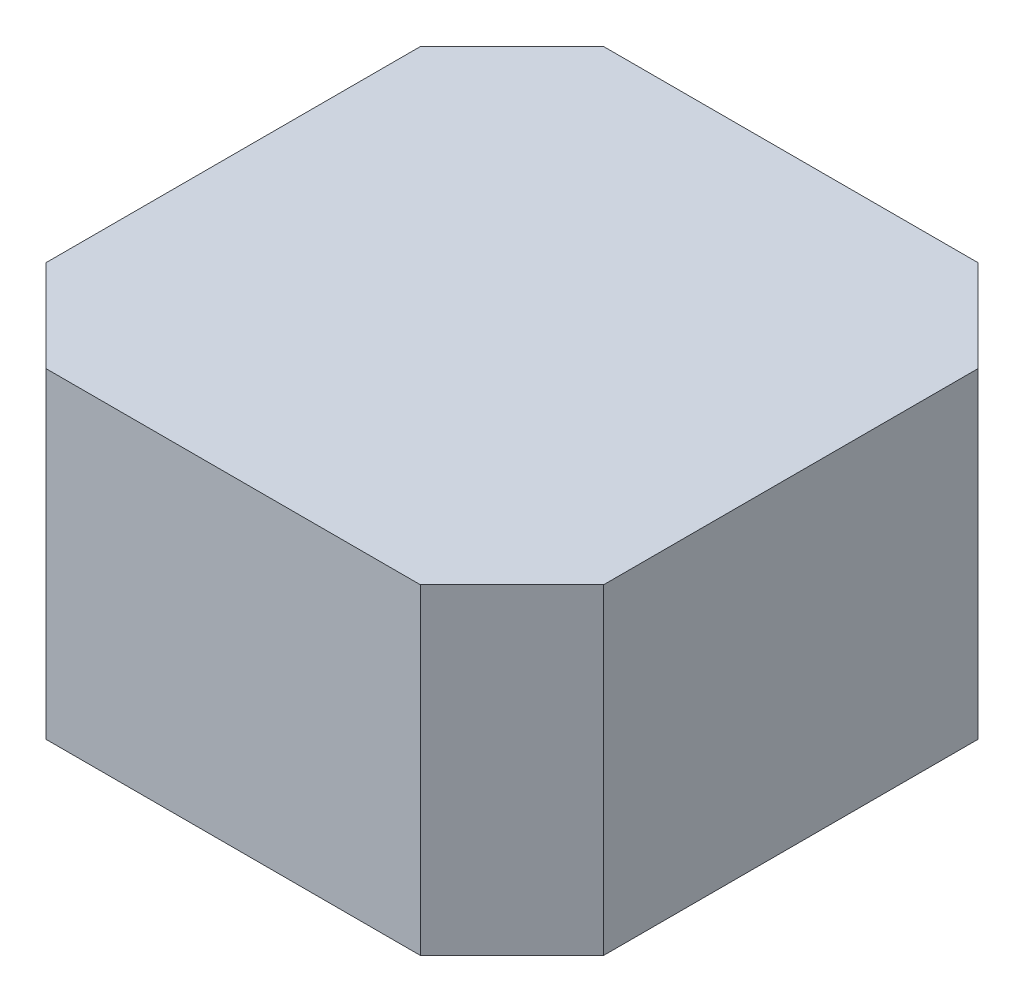
ISO-10303-21;
HEADER;
FILE_DESCRIPTION(('STEP AP214'),'2;1');
FILE_NAME('part.step','',(''),(''),'','','');
FILE_SCHEMA(('AUTOMOTIVE_DESIGN { 1 0 10303 214 1 1 1 1 }'));
ENDSEC;
DATA;
#1=APPLICATION_CONTEXT('core data for automotive mechanical design processes');
#2=APPLICATION_PROTOCOL_DEFINITION('international standard','automotive_design',2000,#1);
#3=PRODUCT_CONTEXT('',#1,'mechanical');
#4=PRODUCT('Part','Part','',(#3));
#5=PRODUCT_RELATED_PRODUCT_CATEGORY('part','',(#4));
#6=PRODUCT_DEFINITION_FORMATION('','',#4);
#7=PRODUCT_DEFINITION_CONTEXT('part definition',#1,'design');
#8=PRODUCT_DEFINITION('design','',#6,#7);
#9=PRODUCT_DEFINITION_SHAPE('','',#8);
#10=(LENGTH_UNIT() NAMED_UNIT(*) SI_UNIT(.MILLI.,.METRE.));
#11=(NAMED_UNIT(*) PLANE_ANGLE_UNIT() SI_UNIT($,.RADIAN.));
#12=(NAMED_UNIT(*) SI_UNIT($,.STERADIAN.) SOLID_ANGLE_UNIT());
#13=UNCERTAINTY_MEASURE_WITH_UNIT(LENGTH_MEASURE(1.E-05),#10,'distance_accuracy_value','');
#14=(GEOMETRIC_REPRESENTATION_CONTEXT(3) GLOBAL_UNCERTAINTY_ASSIGNED_CONTEXT((#13)) GLOBAL_UNIT_ASSIGNED_CONTEXT((#10,
#11,#12)) REPRESENTATION_CONTEXT('',''));
#15=CARTESIAN_POINT('',(0.,0.,0.));
#16=DIRECTION('',(0.,0.,1.));
#17=DIRECTION('',(1.,0.,0.));
#18=AXIS2_PLACEMENT_3D('',#15,#16,#17);
#19=CARTESIAN_POINT('',(0.,3.5,0.));
#20=DIRECTION('',(1.,0.,0.));
#21=DIRECTION('',(0.,0.,-1.));
#22=AXIS2_PLACEMENT_3D('',#19,#20,#21);
#23=PLANE('',#22);
#24=DIRECTION('',(0.,0.,1.));
#25=VECTOR('',#24,1.);
#26=CARTESIAN_POINT('',(0.,3.5,0.));
#27=LINE('',#26,#25);
#28=CARTESIAN_POINT('',(0.,3.5,-5.08));
#29=VERTEX_POINT('',#28);
#30=CARTESIAN_POINT('',(0.,3.5,-1.));
#31=VERTEX_POINT('',#30);
#32=EDGE_CURVE('E124',#29,#31,#27,.T.);
#33=ORIENTED_EDGE('',*,*,#32,.F.);
#34=DIRECTION('',(0.,-1.,0.));
#35=VECTOR('',#34,1.);
#36=CARTESIAN_POINT('',(0.,3.5,-5.08));
#37=LINE('',#36,#35);
#38=CARTESIAN_POINT('',(0.,0.,-5.08));
#39=VERTEX_POINT('',#38);
#40=EDGE_CURVE('E150',#29,#39,#37,.T.);
#41=ORIENTED_EDGE('',*,*,#40,.T.);
#42=DIRECTION('',(0.,0.,1.));
#43=VECTOR('',#42,1.);
#44=CARTESIAN_POINT('',(0.,0.,0.));
#45=LINE('',#44,#43);
#46=CARTESIAN_POINT('',(0.,0.,-1.));
#47=VERTEX_POINT('',#46);
#48=EDGE_CURVE('E156',#39,#47,#45,.T.);
#49=ORIENTED_EDGE('',*,*,#48,.T.);
#50=DIRECTION('',(0.,1.,0.));
#51=VECTOR('',#50,1.);
#52=CARTESIAN_POINT('',(0.,3.5,-1.));
#53=LINE('',#52,#51);
#54=EDGE_CURVE('E148',#47,#31,#53,.T.);
#55=ORIENTED_EDGE('',*,*,#54,.T.);
#56=EDGE_LOOP('',(#33,#41,#49,#55));
#57=FACE_BOUND('',#56,.T.);
#58=ADVANCED_FACE('F32',(#57),#23,.F.);
#59=CARTESIAN_POINT('',(0.,3.5,0.));
#60=DIRECTION('',(0.,0.,-1.));
#61=DIRECTION('',(-1.,0.,0.));
#62=AXIS2_PLACEMENT_3D('',#59,#60,#61);
#63=PLANE('',#62);
#64=DIRECTION('',(1.,0.,0.));
#65=VECTOR('',#64,1.);
#66=CARTESIAN_POINT('',(0.,3.5,0.));
#67=LINE('',#66,#65);
#68=CARTESIAN_POINT('',(1.,3.5,0.));
#69=VERTEX_POINT('',#68);
#70=CARTESIAN_POINT('',(5.08,3.5,0.));
#71=VERTEX_POINT('',#70);
#72=EDGE_CURVE('E127',#69,#71,#67,.T.);
#73=ORIENTED_EDGE('',*,*,#72,.F.);
#74=DIRECTION('',(0.,-1.,0.));
#75=VECTOR('',#74,1.);
#76=CARTESIAN_POINT('',(1.,3.5,0.));
#77=LINE('',#76,#75);
#78=CARTESIAN_POINT('',(1.,0.,0.));
#79=VERTEX_POINT('',#78);
#80=EDGE_CURVE('E11',#69,#79,#77,.T.);
#81=ORIENTED_EDGE('',*,*,#80,.T.);
#82=DIRECTION('',(1.,0.,0.));
#83=VECTOR('',#82,1.);
#84=CARTESIAN_POINT('',(0.,0.,0.));
#85=LINE('',#84,#83);
#86=CARTESIAN_POINT('',(5.08,0.,0.));
#87=VERTEX_POINT('',#86);
#88=EDGE_CURVE('E129',#79,#87,#85,.T.);
#89=ORIENTED_EDGE('',*,*,#88,.T.);
#90=DIRECTION('',(0.,1.,0.));
#91=VECTOR('',#90,1.);
#92=CARTESIAN_POINT('',(5.08,3.5,0.));
#93=LINE('',#92,#91);
#94=EDGE_CURVE('E40',#87,#71,#93,.T.);
#95=ORIENTED_EDGE('',*,*,#94,.T.);
#96=EDGE_LOOP('',(#73,#81,#89,#95));
#97=FACE_BOUND('',#96,.T.);
#98=ADVANCED_FACE('F175',(#97),#63,.F.);
#99=CARTESIAN_POINT('',(6.08,3.5,0.));
#100=DIRECTION('',(-1.,0.,0.));
#101=DIRECTION('',(0.,0.,1.));
#102=AXIS2_PLACEMENT_3D('',#99,#100,#101);
#103=PLANE('',#102);
#104=DIRECTION('',(0.,0.,-1.));
#105=VECTOR('',#104,1.);
#106=CARTESIAN_POINT('',(6.08,0.,0.));
#107=LINE('',#106,#105);
#108=CARTESIAN_POINT('',(6.08,0.,-0.999999999999999));
#109=VERTEX_POINT('',#108);
#110=CARTESIAN_POINT('',(6.08,0.,-5.08));
#111=VERTEX_POINT('',#110);
#112=EDGE_CURVE('E125',#109,#111,#107,.T.);
#113=ORIENTED_EDGE('',*,*,#112,.T.);
#114=DIRECTION('',(0.,1.,0.));
#115=VECTOR('',#114,1.);
#116=CARTESIAN_POINT('',(6.08,3.5,-5.08));
#117=LINE('',#116,#115);
#118=CARTESIAN_POINT('',(6.08,3.5,-5.08));
#119=VERTEX_POINT('',#118);
#120=EDGE_CURVE('E103',#111,#119,#117,.T.);
#121=ORIENTED_EDGE('',*,*,#120,.T.);
#122=DIRECTION('',(0.,0.,-1.));
#123=VECTOR('',#122,1.);
#124=CARTESIAN_POINT('',(6.08,3.5,0.));
#125=LINE('',#124,#123);
#126=CARTESIAN_POINT('',(6.08,3.5,-0.999999999999999));
#127=VERTEX_POINT('',#126);
#128=EDGE_CURVE('E164',#127,#119,#125,.T.);
#129=ORIENTED_EDGE('',*,*,#128,.F.);
#130=DIRECTION('',(0.,-1.,0.));
#131=VECTOR('',#130,1.);
#132=CARTESIAN_POINT('',(6.08,3.5,-0.999999999999999));
#133=LINE('',#132,#131);
#134=EDGE_CURVE('E108',#127,#109,#133,.T.);
#135=ORIENTED_EDGE('',*,*,#134,.T.);
#136=EDGE_LOOP('',(#113,#121,#129,#135));
#137=FACE_BOUND('',#136,.T.);
#138=ADVANCED_FACE('F174',(#137),#103,.F.);
#139=CARTESIAN_POINT('',(0.,3.5,-6.08));
#140=DIRECTION('',(0.,0.,1.));
#141=DIRECTION('',(1.,0.,0.));
#142=AXIS2_PLACEMENT_3D('',#139,#140,#141);
#143=PLANE('',#142);
#144=DIRECTION('',(-1.,0.,0.));
#145=VECTOR('',#144,1.);
#146=CARTESIAN_POINT('',(0.,3.5,-6.08));
#147=LINE('',#146,#145);
#148=CARTESIAN_POINT('',(5.08,3.5,-6.08));
#149=VERTEX_POINT('',#148);
#150=CARTESIAN_POINT('',(1.,3.5,-6.08));
#151=VERTEX_POINT('',#150);
#152=EDGE_CURVE('E118',#149,#151,#147,.T.);
#153=ORIENTED_EDGE('',*,*,#152,.F.);
#154=DIRECTION('',(0.,-1.,0.));
#155=VECTOR('',#154,1.);
#156=CARTESIAN_POINT('',(5.08,3.5,-6.08));
#157=LINE('',#156,#155);
#158=CARTESIAN_POINT('',(5.08,0.,-6.08));
#159=VERTEX_POINT('',#158);
#160=EDGE_CURVE('E102',#149,#159,#157,.T.);
#161=ORIENTED_EDGE('',*,*,#160,.T.);
#162=DIRECTION('',(-1.,0.,0.));
#163=VECTOR('',#162,1.);
#164=CARTESIAN_POINT('',(0.,0.,-6.08));
#165=LINE('',#164,#163);
#166=CARTESIAN_POINT('',(1.,0.,-6.08));
#167=VERTEX_POINT('',#166);
#168=EDGE_CURVE('E115',#159,#167,#165,.T.);
#169=ORIENTED_EDGE('',*,*,#168,.T.);
#170=DIRECTION('',(0.,1.,0.));
#171=VECTOR('',#170,1.);
#172=CARTESIAN_POINT('',(1.,3.5,-6.08));
#173=LINE('',#172,#171);
#174=EDGE_CURVE('E120',#167,#151,#173,.T.);
#175=ORIENTED_EDGE('',*,*,#174,.T.);
#176=EDGE_LOOP('',(#153,#161,#169,#175));
#177=FACE_BOUND('',#176,.T.);
#178=ADVANCED_FACE('F114',(#177),#143,.F.);
#179=CARTESIAN_POINT('',(0.,3.5,0.));
#180=DIRECTION('',(0.,-1.,0.));
#181=DIRECTION('',(0.,0.,-1.));
#182=AXIS2_PLACEMENT_3D('',#179,#180,#181);
#183=PLANE('',#182);
#184=ORIENTED_EDGE('',*,*,#128,.T.);
#185=DIRECTION('',(0.707106781186546,0.,0.707106781186549));
#186=VECTOR('',#185,1.);
#187=CARTESIAN_POINT('',(5.08,3.5,-6.08));
#188=LINE('',#187,#186);
#189=EDGE_CURVE('E146',#119,#149,#188,.F.);
#190=ORIENTED_EDGE('',*,*,#189,.T.);
#191=ORIENTED_EDGE('',*,*,#152,.T.);
#192=DIRECTION('',(0.707106781186549,0.,-0.707106781186546));
#193=VECTOR('',#192,1.);
#194=CARTESIAN_POINT('',(0.,3.5,-5.08));
#195=LINE('',#194,#193);
#196=EDGE_CURVE('E144',#151,#29,#195,.F.);
#197=ORIENTED_EDGE('',*,*,#196,.T.);
#198=ORIENTED_EDGE('',*,*,#32,.T.);
#199=DIRECTION('',(-0.707106781186547,0.,-0.707106781186548));
#200=VECTOR('',#199,1.);
#201=CARTESIAN_POINT('',(1.,3.5,0.));
#202=LINE('',#201,#200);
#203=EDGE_CURVE('E53',#31,#69,#202,.F.);
#204=ORIENTED_EDGE('',*,*,#203,.T.);
#205=ORIENTED_EDGE('',*,*,#72,.T.);
#206=DIRECTION('',(-0.707106781186549,0.,0.707106781186546));
#207=VECTOR('',#206,1.);
#208=CARTESIAN_POINT('',(6.08,3.5,-0.999999999999999));
#209=LINE('',#208,#207);
#210=EDGE_CURVE('E141',#71,#127,#209,.F.);
#211=ORIENTED_EDGE('',*,*,#210,.T.);
#212=EDGE_LOOP('',(#184,#190,#191,#197,#198,#204,#205,#211));
#213=FACE_BOUND('',#212,.T.);
#214=ADVANCED_FACE('F168',(#213),#183,.F.);
#215=CARTESIAN_POINT('',(0.,0.,0.));
#216=DIRECTION('',(0.,-1.,0.));
#217=DIRECTION('',(0.,0.,-1.));
#218=AXIS2_PLACEMENT_3D('',#215,#216,#217);
#219=PLANE('',#218);
#220=ORIENTED_EDGE('',*,*,#168,.F.);
#221=DIRECTION('',(-0.707106781186546,0.,-0.707106781186549));
#222=VECTOR('',#221,1.);
#223=CARTESIAN_POINT('',(5.58000000000001,0.,-5.57999999999999));
#224=LINE('',#223,#222);
#225=EDGE_CURVE('E98',#159,#111,#224,.F.);
#226=ORIENTED_EDGE('',*,*,#225,.T.);
#227=ORIENTED_EDGE('',*,*,#112,.F.);
#228=DIRECTION('',(0.707106781186549,0.,-0.707106781186546));
#229=VECTOR('',#228,1.);
#230=CARTESIAN_POINT('',(2.53999999999999,0.,2.54));
#231=LINE('',#230,#229);
#232=EDGE_CURVE('E119',#109,#87,#231,.F.);
#233=ORIENTED_EDGE('',*,*,#232,.T.);
#234=ORIENTED_EDGE('',*,*,#88,.F.);
#235=DIRECTION('',(0.707106781186547,0.,0.707106781186548));
#236=VECTOR('',#235,1.);
#237=CARTESIAN_POINT('',(0.500000000000002,0.,-0.500000000000001));
#238=LINE('',#237,#236);
#239=EDGE_CURVE('E135',#79,#47,#238,.F.);
#240=ORIENTED_EDGE('',*,*,#239,.T.);
#241=ORIENTED_EDGE('',*,*,#48,.F.);
#242=DIRECTION('',(-0.707106781186549,0.,0.707106781186546));
#243=VECTOR('',#242,1.);
#244=CARTESIAN_POINT('',(-2.54,0.,-2.54000000000001));
#245=LINE('',#244,#243);
#246=EDGE_CURVE('E109',#39,#167,#245,.F.);
#247=ORIENTED_EDGE('',*,*,#246,.T.);
#248=EDGE_LOOP('',(#220,#226,#227,#233,#234,#240,#241,#247));
#249=FACE_BOUND('',#248,.T.);
#250=ADVANCED_FACE('F122',(#249),#219,.T.);
#251=CARTESIAN_POINT('',(5.08,3.5,-6.08));
#252=DIRECTION('',(-0.707106781186549,0.,0.707106781186546));
#253=DIRECTION('',(0.,-1.,0.));
#254=AXIS2_PLACEMENT_3D('',#251,#252,#253);
#255=PLANE('',#254);
#256=ORIENTED_EDGE('',*,*,#189,.F.);
#257=ORIENTED_EDGE('',*,*,#120,.F.);
#258=ORIENTED_EDGE('',*,*,#225,.F.);
#259=ORIENTED_EDGE('',*,*,#160,.F.);
#260=EDGE_LOOP('',(#256,#257,#258,#259));
#261=FACE_BOUND('',#260,.T.);
#262=ADVANCED_FACE('F101',(#261),#255,.F.);
#263=CARTESIAN_POINT('',(0.,3.5,-5.08));
#264=DIRECTION('',(0.707106781186546,0.,0.707106781186549));
#265=DIRECTION('',(0.,-1.,0.));
#266=AXIS2_PLACEMENT_3D('',#263,#264,#265);
#267=PLANE('',#266);
#268=ORIENTED_EDGE('',*,*,#196,.F.);
#269=ORIENTED_EDGE('',*,*,#174,.F.);
#270=ORIENTED_EDGE('',*,*,#246,.F.);
#271=ORIENTED_EDGE('',*,*,#40,.F.);
#272=EDGE_LOOP('',(#268,#269,#270,#271));
#273=FACE_BOUND('',#272,.T.);
#274=ADVANCED_FACE('F178',(#273),#267,.F.);
#275=CARTESIAN_POINT('',(1.,3.5,0.));
#276=DIRECTION('',(0.707106781186548,0.,-0.707106781186547));
#277=DIRECTION('',(0.,-1.,0.));
#278=AXIS2_PLACEMENT_3D('',#275,#276,#277);
#279=PLANE('',#278);
#280=ORIENTED_EDGE('',*,*,#203,.F.);
#281=ORIENTED_EDGE('',*,*,#54,.F.);
#282=ORIENTED_EDGE('',*,*,#239,.F.);
#283=ORIENTED_EDGE('',*,*,#80,.F.);
#284=EDGE_LOOP('',(#280,#281,#282,#283));
#285=FACE_BOUND('',#284,.T.);
#286=ADVANCED_FACE('F177',(#285),#279,.F.);
#287=CARTESIAN_POINT('',(6.08,3.5,-0.999999999999999));
#288=DIRECTION('',(-0.707106781186546,0.,-0.707106781186549));
#289=DIRECTION('',(0.,-1.,0.));
#290=AXIS2_PLACEMENT_3D('',#287,#288,#289);
#291=PLANE('',#290);
#292=ORIENTED_EDGE('',*,*,#210,.F.);
#293=ORIENTED_EDGE('',*,*,#94,.F.);
#294=ORIENTED_EDGE('',*,*,#232,.F.);
#295=ORIENTED_EDGE('',*,*,#134,.F.);
#296=EDGE_LOOP('',(#292,#293,#294,#295));
#297=FACE_BOUND('',#296,.T.);
#298=ADVANCED_FACE('F34',(#297),#291,.F.);
#299=CLOSED_SHELL('',(#58,#98,#138,#178,#214,#250,#262,#274,#286,#298));
#300=MANIFOLD_SOLID_BREP('B2',#299);
#301=ADVANCED_BREP_SHAPE_REPRESENTATION('',(#18,#300),#14);
#302=SHAPE_DEFINITION_REPRESENTATION(#9,#301);
ENDSEC;
END-ISO-10303-21;
